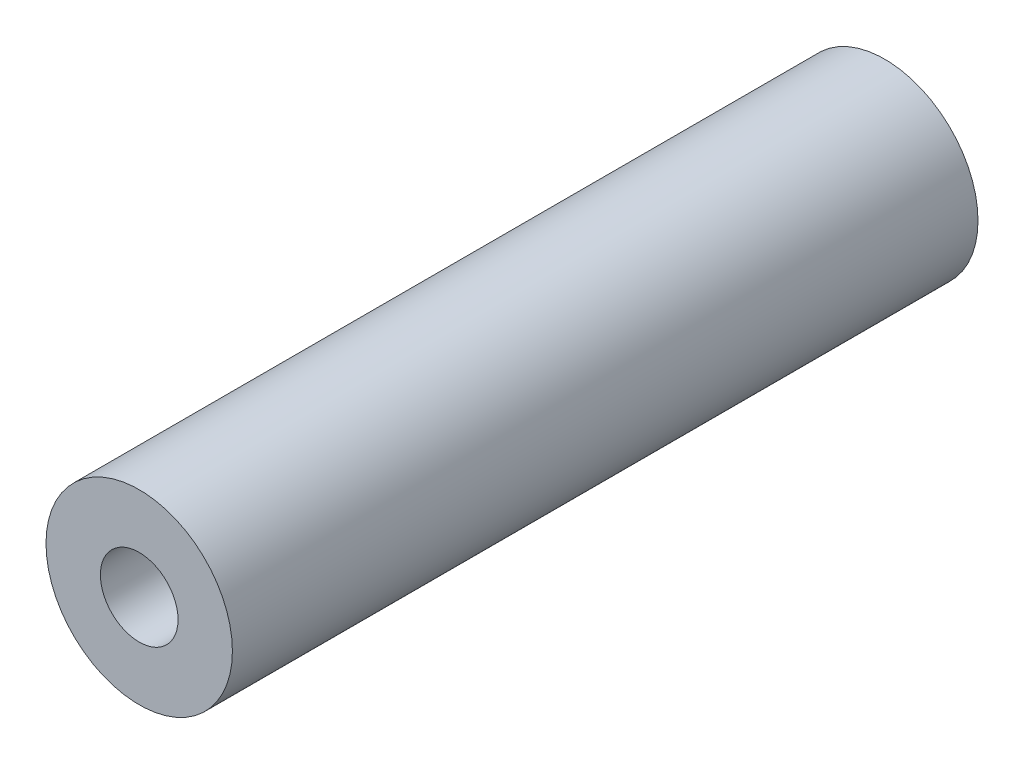
ISO-10303-21;
HEADER;
FILE_DESCRIPTION(('STEP AP214'),'2;1');
FILE_NAME('part.step','',(''),(''),'','','');
FILE_SCHEMA(('AUTOMOTIVE_DESIGN { 1 0 10303 214 1 1 1 1 }'));
ENDSEC;
DATA;
#1=APPLICATION_CONTEXT('core data for automotive mechanical design processes');
#2=APPLICATION_PROTOCOL_DEFINITION('international standard','automotive_design',2000,#1);
#3=PRODUCT_CONTEXT('',#1,'mechanical');
#4=PRODUCT('Part','Part','',(#3));
#5=PRODUCT_RELATED_PRODUCT_CATEGORY('part','',(#4));
#6=PRODUCT_DEFINITION_FORMATION('','',#4);
#7=PRODUCT_DEFINITION_CONTEXT('part definition',#1,'design');
#8=PRODUCT_DEFINITION('design','',#6,#7);
#9=PRODUCT_DEFINITION_SHAPE('','',#8);
#10=(LENGTH_UNIT() NAMED_UNIT(*) SI_UNIT(.MILLI.,.METRE.));
#11=(NAMED_UNIT(*) PLANE_ANGLE_UNIT() SI_UNIT($,.RADIAN.));
#12=(NAMED_UNIT(*) SI_UNIT($,.STERADIAN.) SOLID_ANGLE_UNIT());
#13=UNCERTAINTY_MEASURE_WITH_UNIT(LENGTH_MEASURE(1.E-05),#10,'distance_accuracy_value','');
#14=(GEOMETRIC_REPRESENTATION_CONTEXT(3) GLOBAL_UNCERTAINTY_ASSIGNED_CONTEXT((#13)) GLOBAL_UNIT_ASSIGNED_CONTEXT((#10,
#11,#12)) REPRESENTATION_CONTEXT('',''));
#15=CARTESIAN_POINT('',(0.,0.,0.));
#16=DIRECTION('',(0.,0.,1.));
#17=DIRECTION('',(1.,0.,0.));
#18=AXIS2_PLACEMENT_3D('',#15,#16,#17);
#19=CARTESIAN_POINT('',(0.,0.,12.));
#20=DIRECTION('',(0.,0.,-1.));
#21=DIRECTION('',(-1.,0.,0.));
#22=AXIS2_PLACEMENT_3D('',#19,#20,#21);
#23=CYLINDRICAL_SURFACE('',#22,3.);
#24=CARTESIAN_POINT('',(0.,0.,12.));
#25=DIRECTION('',(0.,0.,1.));
#26=DIRECTION('',(1.,0.,0.));
#27=AXIS2_PLACEMENT_3D('',#24,#25,#26);
#28=CIRCLE('',#27,3.);
#29=CARTESIAN_POINT('',(3.,0.,12.));
#30=VERTEX_POINT('',#29);
#31=EDGE_CURVE('E10',#30,#30,#28,.T.);
#32=ORIENTED_EDGE('',*,*,#31,.F.);
#33=EDGE_LOOP('',(#32));
#34=FACE_BOUND('',#33,.T.);
#35=CARTESIAN_POINT('',(0.,0.,-12.));
#36=DIRECTION('',(0.,0.,1.));
#37=DIRECTION('',(1.,0.,0.));
#38=AXIS2_PLACEMENT_3D('',#35,#36,#37);
#39=CIRCLE('',#38,3.);
#40=CARTESIAN_POINT('',(3.,0.,-12.));
#41=VERTEX_POINT('',#40);
#42=EDGE_CURVE('E33',#41,#41,#39,.T.);
#43=ORIENTED_EDGE('',*,*,#42,.T.);
#44=EDGE_LOOP('',(#43));
#45=FACE_BOUND('',#44,.T.);
#46=ADVANCED_FACE('F30',(#34,#45),#23,.T.);
#47=CARTESIAN_POINT('',(0.,0.,12.));
#48=DIRECTION('',(0.,0.,1.));
#49=DIRECTION('',(1.,0.,0.));
#50=AXIS2_PLACEMENT_3D('',#47,#48,#49);
#51=PLANE('',#50);
#52=CARTESIAN_POINT('',(0.,0.,12.));
#53=DIRECTION('',(0.,0.,1.));
#54=DIRECTION('',(1.,0.,0.));
#55=AXIS2_PLACEMENT_3D('',#52,#53,#54);
#56=CIRCLE('',#55,1.25);
#57=CARTESIAN_POINT('',(1.25,0.,12.));
#58=VERTEX_POINT('',#57);
#59=EDGE_CURVE('E42',#58,#58,#56,.T.);
#60=ORIENTED_EDGE('',*,*,#59,.F.);
#61=EDGE_LOOP('',(#60));
#62=FACE_BOUND('',#61,.T.);
#63=ORIENTED_EDGE('',*,*,#31,.T.);
#64=EDGE_LOOP('',(#63));
#65=FACE_BOUND('',#64,.T.);
#66=ADVANCED_FACE('F66',(#62,#65),#51,.T.);
#67=CARTESIAN_POINT('',(0.,0.,-12.));
#68=DIRECTION('',(0.,0.,1.));
#69=DIRECTION('',(1.,0.,0.));
#70=AXIS2_PLACEMENT_3D('',#67,#68,#69);
#71=PLANE('',#70);
#72=CARTESIAN_POINT('',(0.,0.,-12.));
#73=DIRECTION('',(0.,0.,1.));
#74=DIRECTION('',(1.,0.,0.));
#75=AXIS2_PLACEMENT_3D('',#72,#73,#74);
#76=CIRCLE('',#75,1.25);
#77=CARTESIAN_POINT('',(1.25,0.,-12.));
#78=VERTEX_POINT('',#77);
#79=EDGE_CURVE('E48',#78,#78,#76,.T.);
#80=ORIENTED_EDGE('',*,*,#79,.T.);
#81=EDGE_LOOP('',(#80));
#82=FACE_BOUND('',#81,.T.);
#83=ORIENTED_EDGE('',*,*,#42,.F.);
#84=EDGE_LOOP('',(#83));
#85=FACE_BOUND('',#84,.T.);
#86=ADVANCED_FACE('F71',(#82,#85),#71,.F.);
#87=CARTESIAN_POINT('',(0.,0.,6.));
#88=DIRECTION('',(0.,0.,1.));
#89=DIRECTION('',(1.,0.,0.));
#90=AXIS2_PLACEMENT_3D('',#87,#88,#89);
#91=CYLINDRICAL_SURFACE('',#90,1.25);
#92=CARTESIAN_POINT('',(0.,0.,6.));
#93=DIRECTION('',(0.,0.,1.));
#94=DIRECTION('',(1.,0.,0.));
#95=AXIS2_PLACEMENT_3D('',#92,#93,#94);
#96=CIRCLE('',#95,1.25);
#97=CARTESIAN_POINT('',(1.25,0.,6.));
#98=VERTEX_POINT('',#97);
#99=EDGE_CURVE('E40',#98,#98,#96,.T.);
#100=ORIENTED_EDGE('',*,*,#99,.F.);
#101=EDGE_LOOP('',(#100));
#102=FACE_BOUND('',#101,.T.);
#103=ORIENTED_EDGE('',*,*,#59,.T.);
#104=EDGE_LOOP('',(#103));
#105=FACE_BOUND('',#104,.T.);
#106=ADVANCED_FACE('F78',(#102,#105),#91,.F.);
#107=CARTESIAN_POINT('',(0.,0.,6.));
#108=DIRECTION('',(0.,0.,1.));
#109=DIRECTION('',(1.,0.,0.));
#110=AXIS2_PLACEMENT_3D('',#107,#108,#109);
#111=PLANE('',#110);
#112=ORIENTED_EDGE('',*,*,#99,.T.);
#113=EDGE_LOOP('',(#112));
#114=FACE_BOUND('',#113,.T.);
#115=ADVANCED_FACE('F63',(#114),#111,.T.);
#116=CARTESIAN_POINT('',(0.,0.,-6.));
#117=DIRECTION('',(0.,0.,-1.));
#118=DIRECTION('',(-1.,0.,0.));
#119=AXIS2_PLACEMENT_3D('',#116,#117,#118);
#120=CYLINDRICAL_SURFACE('',#119,1.25);
#121=CARTESIAN_POINT('',(0.,0.,-6.));
#122=DIRECTION('',(0.,0.,1.));
#123=DIRECTION('',(1.,0.,0.));
#124=AXIS2_PLACEMENT_3D('',#121,#122,#123);
#125=CIRCLE('',#124,1.25);
#126=CARTESIAN_POINT('',(1.25,0.,-6.));
#127=VERTEX_POINT('',#126);
#128=EDGE_CURVE('E45',#127,#127,#125,.T.);
#129=ORIENTED_EDGE('',*,*,#128,.T.);
#130=EDGE_LOOP('',(#129));
#131=FACE_BOUND('',#130,.T.);
#132=ORIENTED_EDGE('',*,*,#79,.F.);
#133=EDGE_LOOP('',(#132));
#134=FACE_BOUND('',#133,.T.);
#135=ADVANCED_FACE('F54',(#131,#134),#120,.F.);
#136=CARTESIAN_POINT('',(0.,0.,-6.));
#137=DIRECTION('',(0.,0.,-1.));
#138=DIRECTION('',(1.,0.,0.));
#139=AXIS2_PLACEMENT_3D('',#136,#137,#138);
#140=PLANE('',#139);
#141=ORIENTED_EDGE('',*,*,#128,.F.);
#142=EDGE_LOOP('',(#141));
#143=FACE_BOUND('',#142,.T.);
#144=ADVANCED_FACE('F57',(#143),#140,.T.);
#145=CLOSED_SHELL('',(#46,#66,#86,#106,#115,#135,#144));
#146=MANIFOLD_SOLID_BREP('B2',#145);
#147=ADVANCED_BREP_SHAPE_REPRESENTATION('',(#18,#146),#14);
#148=SHAPE_DEFINITION_REPRESENTATION(#9,#147);
ENDSEC;
END-ISO-10303-21;
